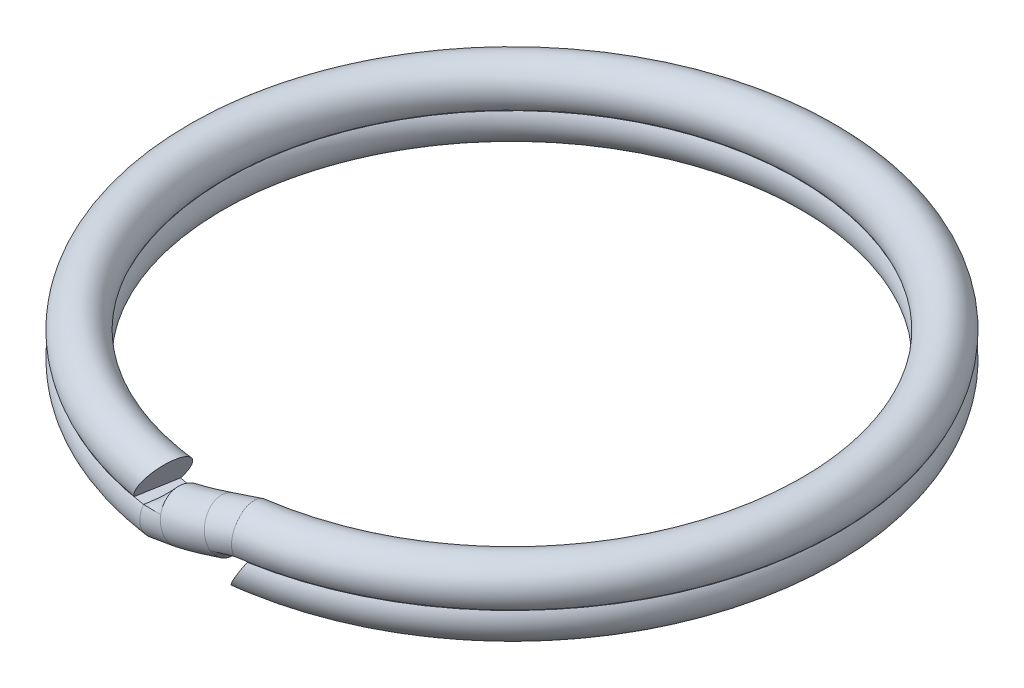
ISO-10303-21;
HEADER;
FILE_DESCRIPTION(('STEP AP214'),'2;1');
FILE_NAME('part.step','',(''),(''),'','','');
FILE_SCHEMA(('AUTOMOTIVE_DESIGN { 1 0 10303 214 1 1 1 1 }'));
ENDSEC;
DATA;
#1=APPLICATION_CONTEXT('core data for automotive mechanical design processes');
#2=APPLICATION_PROTOCOL_DEFINITION('international standard','automotive_design',2000,#1);
#3=PRODUCT_CONTEXT('',#1,'mechanical');
#4=PRODUCT('Part','Part','',(#3));
#5=PRODUCT_RELATED_PRODUCT_CATEGORY('part','',(#4));
#6=PRODUCT_DEFINITION_FORMATION('','',#4);
#7=PRODUCT_DEFINITION_CONTEXT('part definition',#1,'design');
#8=PRODUCT_DEFINITION('design','',#6,#7);
#9=PRODUCT_DEFINITION_SHAPE('','',#8);
#10=(LENGTH_UNIT() NAMED_UNIT(*) SI_UNIT(.MILLI.,.METRE.));
#11=(NAMED_UNIT(*) PLANE_ANGLE_UNIT() SI_UNIT($,.RADIAN.));
#12=(NAMED_UNIT(*) SI_UNIT($,.STERADIAN.) SOLID_ANGLE_UNIT());
#13=UNCERTAINTY_MEASURE_WITH_UNIT(LENGTH_MEASURE(1.E-05),#10,'distance_accuracy_value','');
#14=(GEOMETRIC_REPRESENTATION_CONTEXT(3) GLOBAL_UNCERTAINTY_ASSIGNED_CONTEXT((#13)) GLOBAL_UNIT_ASSIGNED_CONTEXT((#10,
#11,#12)) REPRESENTATION_CONTEXT('',''));
#15=CARTESIAN_POINT('',(0.,0.,0.));
#16=DIRECTION('',(0.,0.,1.));
#17=DIRECTION('',(1.,0.,0.));
#18=AXIS2_PLACEMENT_3D('',#15,#16,#17);
#19=CARTESIAN_POINT('',(-0.000247264741250497,-0.0100000000000067,-14.1672261061629));
#20=DIRECTION('',(0.,1.,0.));
#21=DIRECTION('',(0.,0.,-1.));
#22=AXIS2_PLACEMENT_3D('',#19,#20,#21);
#23=PLANE('',#22);
#24=CARTESIAN_POINT('',(0.,-0.01000000000001,0.));
#25=DIRECTION('',(0.,1.,0.));
#26=DIRECTION('',(0.,0.,-1.));
#27=AXIS2_PLACEMENT_3D('',#24,#25,#26);
#28=CIRCLE('',#27,14.1672261083207);
#29=CARTESIAN_POINT('',(2.45442700180832,-0.01000000000001,13.9529955098208));
#30=VERTEX_POINT('',#29);
#31=CARTESIAN_POINT('',(-1.9716967894974,-0.01000000000001,14.0293516377119));
#32=VERTEX_POINT('',#31);
#33=EDGE_CURVE('E13',#30,#32,#28,.T.);
#34=ORIENTED_EDGE('',*,*,#33,.F.);
#35=DIRECTION('',(0.17364817766693,0.,0.984807753012208));
#36=VECTOR('',#35,1.);
#37=CARTESIAN_POINT('',(-2.42843159783578,-0.0100000000000067,-13.7390716941048));
#38=LINE('',#37,#36);
#39=CARTESIAN_POINT('',(2.79921378117034,-0.01000000000001,15.9083785032612));
#40=VERTEX_POINT('',#39);
#41=EDGE_CURVE('E97',#30,#40,#38,.T.);
#42=ORIENTED_EDGE('',*,*,#41,.T.);
#43=CARTESIAN_POINT('',(0.,-0.01000000000001,0.));
#44=DIRECTION('',(0.,1.,0.));
#45=DIRECTION('',(0.,0.,-1.));
#46=AXIS2_PLACEMENT_3D('',#43,#44,#45);
#47=CIRCLE('',#46,16.1527738916793);
#48=CARTESIAN_POINT('',(-2.24803163161179,-0.01000000000001,15.9955762065325));
#49=VERTEX_POINT('',#48);
#50=EDGE_CURVE('E305',#40,#49,#47,.T.);
#51=ORIENTED_EDGE('',*,*,#50,.T.);
#52=DIRECTION('',(0.139173100960066,0.,-0.99026806874157));
#53=VECTOR('',#52,1.);
#54=CARTESIAN_POINT('',(-2.24803163161179,-0.0100000000000067,15.9955762065325));
#55=LINE('',#54,#53);
#56=EDGE_CURVE('E323',#49,#32,#55,.T.);
#57=ORIENTED_EDGE('',*,*,#56,.T.);
#58=EDGE_LOOP('',(#34,#42,#51,#57));
#59=FACE_BOUND('',#58,.T.);
#60=ADVANCED_FACE('F79',(#59),#23,.T.);
#61=CARTESIAN_POINT('',(0.,-0.610000000000004,0.));
#62=DIRECTION('',(0.,1.,0.));
#63=DIRECTION('',(0.,0.,-1.));
#64=AXIS2_PLACEMENT_3D('',#61,#62,#63);
#65=TOROIDAL_SURFACE('',#64,15.16,1.16);
#66=ORIENTED_EDGE('',*,*,#50,.F.);
#67=CARTESIAN_POINT('',(2.79930650983857,-0.00980000000002514,15.9082394281338));
#68=CARTESIAN_POINT('',(2.77026880045595,-0.0724381777679327,15.9518195426377));
#69=CARTESIAN_POINT('',(2.73848436077802,-0.137914686635183,15.9892591373831));
#70=CARTESIAN_POINT('',(2.67062390868274,-0.272381484915059,16.0514823232684));
#71=CARTESIAN_POINT('',(2.6345565854513,-0.34136450288687,16.0762910169426));
#72=CARTESIAN_POINT('',(2.55925690858548,-0.480855720794433,16.1130295921322));
#73=CARTESIAN_POINT('',(2.52002878288431,-0.551361793970344,16.1249763803383));
#74=CARTESIAN_POINT('',(2.43939982941386,-0.69218707966547,16.1359266715269));
#75=CARTESIAN_POINT('',(2.39799776896257,-0.762506161888424,16.1349227504097));
#76=CARTESIAN_POINT('',(2.31233947816636,-0.90400205424407,16.1195799038511));
#77=CARTESIAN_POINT('',(2.26803636050906,-0.975091215185689,16.1046836487901));
#78=CARTESIAN_POINT('',(2.17951784514438,-1.11288301225348,16.0608041840619));
#79=CARTESIAN_POINT('',(2.13530244973517,-1.1795855348916,16.0318206101));
#80=CARTESIAN_POINT('',(2.04965594179575,-1.30439641111536,15.9610697838222));
#81=CARTESIAN_POINT('',(2.00818124083626,-1.36269854699817,15.9196996219868));
#82=CARTESIAN_POINT('',(1.92817750932939,-1.47052454663615,15.8244787831424));
#83=CARTESIAN_POINT('',(1.88964672335345,-1.52005366525853,15.7706356221313));
#84=CARTESIAN_POINT('',(1.8209181383616,-1.60329612822704,15.6576232933277));
#85=CARTESIAN_POINT('',(1.7902720760024,-1.63809839079433,15.5995323632382));
#86=CARTESIAN_POINT('',(1.73420948673364,-1.69647707904384,15.4756846990764));
#87=CARTESIAN_POINT('',(1.70878678803208,-1.72006679699349,15.4099371575308));
#88=CARTESIAN_POINT('',(1.66752732294195,-1.75202603094436,15.2822020492258));
#89=CARTESIAN_POINT('',(1.650864203801,-1.7620061313701,15.2208829188145));
#90=CARTESIAN_POINT('',(1.62330521050077,-1.77150826925623,15.0961810722891));
#91=CARTESIAN_POINT('',(1.61240485204731,-1.77103845062376,15.0328000015668));
#92=CARTESIAN_POINT('',(1.5976340297815,-1.76006287275399,14.9125386005896));
#93=CARTESIAN_POINT('',(1.59317400902962,-1.75055617426433,14.8556364316183));
#94=CARTESIAN_POINT('',(1.58941876057395,-1.72328912695904,14.7436811254554));
#95=CARTESIAN_POINT('',(1.5901227814073,-1.70552997937854,14.6886277204058));
#96=CARTESIAN_POINT('',(1.59647835379539,-1.66279604249256,14.5825889859404));
#97=CARTESIAN_POINT('',(1.60206331157416,-1.63792139561911,14.5315589407843));
#98=CARTESIAN_POINT('',(1.61771775255161,-1.58183777093924,14.4338712990809));
#99=CARTESIAN_POINT('',(1.62778828687195,-1.55062730937158,14.3872147304901));
#100=CARTESIAN_POINT('',(1.65284441769747,-1.48036505034788,14.2957052054421));
#101=CARTESIAN_POINT('',(1.66814565876901,-1.44089733854376,14.251259514735));
#102=CARTESIAN_POINT('',(1.70271015977786,-1.3571739882564,14.1689188276892));
#103=CARTESIAN_POINT('',(1.7219753276518,-1.31291604899773,14.131027002115));
#104=CARTESIAN_POINT('',(1.76669420582848,-1.21447999943221,14.0573574597559));
#105=CARTESIAN_POINT('',(1.79263425568505,-1.15977373965337,14.0225819056526));
#106=CARTESIAN_POINT('',(1.84793906998279,-1.04722557244376,13.962027830872));
#107=CARTESIAN_POINT('',(1.87730532314987,-0.989382307833049,13.9362532407895));
#108=CARTESIAN_POINT('',(1.94334369986019,-0.86297932594136,13.8905073519031));
#109=CARTESIAN_POINT('',(1.98045013383227,-0.794117252775527,13.8719938687206));
#110=CARTESIAN_POINT('',(2.05724009476718,-0.655577860068326,13.846871769259));
#111=CARTESIAN_POINT('',(2.09692687935009,-0.585899604758329,13.8402785165921));
#112=CARTESIAN_POINT('',(2.18202648091491,-0.440364908888126,13.8390245533157));
#113=CARTESIAN_POINT('',(2.22761248411407,-0.364596286246601,13.8456380099991));
#114=CARTESIAN_POINT('',(2.31941932184459,-0.216415626554013,13.8736252994693));
#115=CARTESIAN_POINT('',(2.36563800727003,-0.143994738420782,13.8949575157477));
#116=CARTESIAN_POINT('',(2.42586796922235,-0.0526325750479024,13.9327751534876));
#117=CARTESIAN_POINT('',(2.44024738711478,-0.031049704362042,13.9425655587008));
#118=CARTESIAN_POINT('',(2.45456171993387,-0.00980000000000684,13.9530945687393));
#119=B_SPLINE_CURVE_WITH_KNOTS('',3,(#67,#68,#69,#70,#71,#72,#73,#74,#75,#76,#77,#78,#79,#80,
#81,#82,#83,#84,#85,#86,#87,#88,#89,#90,#91,#92,#93,#94,#95,#96,#97,#98,#99,#100,#101,#102,#103,
#104,#105,#106,#107,#108,#109,#110,#111,#112,#113,#114,#115,#116,#117,#118),.UNSPECIFIED.,.F.,
.F.,(4,2,2,2,2,2,2,2,2,2,2,2,2,2,2,2,2,2,2,2,2,2,2,2,2,4),(0.,0.244442104600478,
0.488396492131621,0.732029814002172,0.97580280686281,1.2297964269369,1.48379661557367,
1.73039588819417,1.97684694942843,2.19854273552713,2.41997504574169,2.6118682429643,
2.80361189782452,2.97635593279866,3.14907483084285,3.31947336784659,3.48991185599071,
3.67331713117677,3.85681089126628,4.06546293835242,4.27420598725931,4.51437439786218,
4.75485213393863,5.01964935253698,5.28370092282716,5.36681802321146),.UNSPECIFIED.);
#120=EDGE_CURVE('E90',#40,#30,#119,.T.);
#121=ORIENTED_EDGE('',*,*,#120,.T.);
#122=ORIENTED_EDGE('',*,*,#33,.T.);
#123=CARTESIAN_POINT('',(-2.24803163161179,-0.0100000000000108,15.9955762065325));
#124=CARTESIAN_POINT('',(-2.25604256474566,-0.105241647612739,16.0525769576012));
#125=CARTESIAN_POINT('',(-2.263722062622,-0.225424987315131,16.1072194242736));
#126=CARTESIAN_POINT('',(-2.27240300123487,-0.53193518078214,16.1689875120415));
#127=CARTESIAN_POINT('',(-2.27328461423672,-0.721036379465518,16.1752605145018));
#128=CARTESIAN_POINT('',(-2.26113721989127,-1.02897629245318,16.0888273125703));
#129=CARTESIAN_POINT('',(-2.25480151054975,-1.13484825752173,16.0437463981518));
#130=CARTESIAN_POINT('',(-2.23676801232705,-1.33702216962556,15.9154313909094));
#131=CARTESIAN_POINT('',(-2.22504354806371,-1.43306264813932,15.8320074928788));
#132=CARTESIAN_POINT('',(-2.19696510905035,-1.59522440156845,15.6322190180714));
#133=CARTESIAN_POINT('',(-2.18062897269775,-1.66096510332263,15.5159813680873));
#134=CARTESIAN_POINT('',(-2.14591517042232,-1.74840460093638,15.2689798304279));
#135=CARTESIAN_POINT('',(-2.12759503489837,-1.77000000000001,15.1386252928108));
#136=CARTESIAN_POINT('',(-2.09213338621083,-1.77,14.8863025514336));
#137=CARTESIAN_POINT('',(-2.07381325068687,-1.74840460093638,14.7559480138165));
#138=CARTESIAN_POINT('',(-2.03909944841144,-1.66096510332263,14.5089464761571));
#139=CARTESIAN_POINT('',(-2.02276331205884,-1.59522440156845,14.392708826173));
#140=CARTESIAN_POINT('',(-1.99468487304548,-1.43306264813932,14.1929203513656));
#141=CARTESIAN_POINT('',(-1.98296040878214,-1.33702216962556,14.109496453335));
#142=CARTESIAN_POINT('',(-1.96492691055944,-1.13484825752173,13.9811814460926));
#143=CARTESIAN_POINT('',(-1.95859120121793,-1.02897629245318,13.9361005316741));
#144=CARTESIAN_POINT('',(-1.94644380687248,-0.721036379465516,13.8496673297427));
#145=CARTESIAN_POINT('',(-1.94732541987433,-0.531935180782137,13.8559403322029));
#146=CARTESIAN_POINT('',(-1.9560063584872,-0.225424987315129,13.9177084199708));
#147=CARTESIAN_POINT('',(-1.96368585636354,-0.105241647612737,13.9723508866432));
#148=CARTESIAN_POINT('',(-1.9716967894974,-0.0100000000000087,14.0293516377119));
#149=B_SPLINE_CURVE_WITH_KNOTS('',3,(#123,#124,#125,#126,#127,#128,#129,#130,#131,#132,#133,
#134,#135,#136,#137,#138,#139,#140,#141,#142,#143,#144,#145,#146,#147,#148),.UNSPECIFIED.,.F.,
.F.,(4,2,2,2,2,2,2,2,2,2,2,2,4),(0.,0.125,0.25,0.3125,0.375,0.4375,0.5,0.5625,0.625,0.6875,0.75,
0.875,1.),.UNSPECIFIED.);
#150=EDGE_CURVE('E308',#32,#49,#149,.F.);
#151=ORIENTED_EDGE('',*,*,#150,.T.);
#152=EDGE_LOOP('',(#66,#121,#122,#151));
#153=FACE_BOUND('',#152,.T.);
#154=ADVANCED_FACE('F81',(#153),#65,.T.);
#155=CARTESIAN_POINT('',(0.,0.,0.));
#156=DIRECTION('',(-0.852868531952443,0.500000000000001,0.150383733180435));
#157=DIRECTION('',(-0.505751557519977,-0.862679176789447,0.));
#158=AXIS2_PLACEMENT_3D('',#155,#156,#157);
#159=PLANE('',#158);
#160=ORIENTED_EDGE('',*,*,#120,.F.);
#161=ORIENTED_EDGE('',*,*,#41,.F.);
#162=EDGE_LOOP('',(#160,#161));
#163=FACE_BOUND('',#162,.T.);
#164=ADVANCED_FACE('F289',(#163),#159,.T.);
#165=CARTESIAN_POINT('',(-2.24803163161179,-0.0100000000000108,15.9955762065325));
#166=CARTESIAN_POINT('',(-1.22324830780551,0.159764482728053,16.1704310559297));
#167=CARTESIAN_POINT('',(-2.25604256474566,-0.105241647612739,16.0525769576012));
#168=CARTESIAN_POINT('',(-1.1980510529914,0.0605401106211243,16.218380984122));
#169=CARTESIAN_POINT('',(-2.263722062622,-0.225424987315131,16.1072194242736));
#170=CARTESIAN_POINT('',(-1.16587960361662,-0.0612013712749404,16.2599552402179));
#171=CARTESIAN_POINT('',(-2.27240300123487,-0.53193518078214,16.1689875120415));
#172=CARTESIAN_POINT('',(-1.0831876712905,-0.354682314656631,16.2896118992778));
#173=CARTESIAN_POINT('',(-2.27328461423672,-0.721036379465518,16.1752605145018));
#174=CARTESIAN_POINT('',(-1.03208484167273,-0.528124357848302,16.276456515204));
#175=CARTESIAN_POINT('',(-2.26113721989127,-1.02897629245318,16.0888273125703));
#176=CARTESIAN_POINT('',(-0.947110608409819,-0.795580701727408,16.1713915635649));
#177=CARTESIAN_POINT('',(-2.25480151054975,-1.13484825752173,16.0437463981518));
#178=CARTESIAN_POINT('',(-0.917578554198549,-0.88531582778619,16.1220995437286));
#179=CARTESIAN_POINT('',(-2.23676801232705,-1.33702216962556,15.9154313909094));
#180=CARTESIAN_POINT('',(-0.859508548151624,-1.05354124314122,15.9925090312137));
#181=CARTESIAN_POINT('',(-2.22504354806371,-1.43306264813932,15.8320074928788));
#182=CARTESIAN_POINT('',(-0.831015626631528,-1.13185388577129,15.9121235692646));
#183=CARTESIAN_POINT('',(-2.19696510905035,-1.59522440156845,15.6322190180714));
#184=CARTESIAN_POINT('',(-0.779452602835592,-1.26328923982537,15.7257993009933));
#185=CARTESIAN_POINT('',(-2.18062897269775,-1.66096510332263,15.5159813680873));
#186=CARTESIAN_POINT('',(-0.756450132628366,-1.3162031619365,15.6199603328279));
#187=CARTESIAN_POINT('',(-2.14591517042232,-1.74840460093638,15.2689798304279));
#188=CARTESIAN_POINT('',(-0.719492443720995,-1.38779807076383,15.3966035628726));
#189=CARTESIAN_POINT('',(-2.12759503489837,-1.77000000000001,15.1386252928108));
#190=CARTESIAN_POINT('',(-0.705570217466573,-1.40642646439241,15.2793301167882));
#191=CARTESIAN_POINT('',(-2.09213338621083,-1.77,14.8863025514336));
#192=CARTESIAN_POINT('',(-0.687860288841409,-1.40990280717912,15.0498386054885));
#193=CARTESIAN_POINT('',(-2.07381325068687,-1.74840460093638,14.7559480138165));
#194=CARTESIAN_POINT('',(-0.683585630645351,-1.39484634257063,14.9313103946678));
#195=CARTESIAN_POINT('',(-2.03909944841144,-1.66096510332263,14.5089464761571));
#196=CARTESIAN_POINT('',(-0.68567836127334,-1.33009519628965,14.7028747189118));
#197=CARTESIAN_POINT('',(-2.02276331205884,-1.59522440156845,14.392708826173));
#198=CARTESIAN_POINT('',(-0.692050752586743,-1.28044564954832,14.5932152500619));
#199=CARTESIAN_POINT('',(-1.99468487304548,-1.43306264813932,14.1929203513656));
#200=CARTESIAN_POINT('',(-0.714117372333569,-1.15480024607057,14.3973146948227));
#201=CARTESIAN_POINT('',(-1.98296040878214,-1.33702216962556,14.109496453335));
#202=CARTESIAN_POINT('',(-0.72976056878489,-1.07900992015896,14.3111888800619));
#203=CARTESIAN_POINT('',(-1.96492691055944,-1.13484825752173,13.9811814460926));
#204=CARTESIAN_POINT('',(-0.766874160202362,-0.914898111491697,14.1692187687863));
#205=CARTESIAN_POINT('',(-1.95859120121793,-1.02897629245318,13.9361005316741));
#206=CARTESIAN_POINT('',(-0.788287130284545,-0.826756708374674,14.113300828346));
#207=CARTESIAN_POINT('',(-1.94644380687248,-0.721036379465516,13.8496673297427));
#208=CARTESIAN_POINT('',(-0.855517926787301,-0.562783284709313,13.9884400584352));
#209=CARTESIAN_POINT('',(-1.94732541987433,-0.531935180782137,13.8559403322029));
#210=CARTESIAN_POINT('',(-0.90359490015158,-0.389935197246266,13.9623853282683));
#211=CARTESIAN_POINT('',(-1.9560063584872,-0.225424987315129,13.9177084199708));
#212=CARTESIAN_POINT('',(-0.989175147237402,-0.0958872966287149,13.9701564721849));
#213=CARTESIAN_POINT('',(-1.96368585636354,-0.105241647612737,13.9723508866432));
#214=CARTESIAN_POINT('',(-1.02706005159951,0.0269756989929425,14.0026191841388));
#215=CARTESIAN_POINT('',(-1.9716967894974,-0.0100000000000087,14.0293516377119));
#216=CARTESIAN_POINT('',(-1.05908361397534,0.127540030483916,14.0431269607794));
#217=B_SPLINE_SURFACE_WITH_KNOTS('',3,1,((#165,#166),(#167,#168),(#169,#170),(#171,#172),(#173,
#174),(#175,#176),(#177,#178),(#179,#180),(#181,#182),(#183,#184),(#185,#186),(#187,#188),(#189,
#190),(#191,#192),(#193,#194),(#195,#196),(#197,#198),(#199,#200),(#201,#202),(#203,#204),(#205,
#206),(#207,#208),(#209,#210),(#211,#212),(#213,#214),(#215,#216)),.UNSPECIFIED.,.F.,.F.,.F.,(4,
2,2,2,2,2,2,2,2,2,2,2,4),(2,2),(0.,0.125,0.25,0.3125,0.375,0.4375,0.5,0.5625,0.625,0.6875,0.75,
0.875,1.),(0.,1.),.UNSPECIFIED.);
#218=DIRECTION('',(0.98872297765662,0.149010547003397,0.0149241527590682));
#219=VECTOR('',#218,1.);
#220=CARTESIAN_POINT('',(-1.51539020173637,0.0587700152419538,14.0362392992456));
#221=LINE('',#220,#219);
#222=CARTESIAN_POINT('',(-1.0591479289858,0.128184545251658,14.0414505674586));
#223=VERTEX_POINT('',#222);
#224=EDGE_CURVE('E356',#32,#223,#221,.T.);
#225=CARTESIAN_POINT('',(-1.01590095115834,-0.293715385618915,15.1230710019389));
#226=DIRECTION('',(0.958315333271212,0.277066339327014,0.0697564737441255));
#227=DIRECTION('',(-0.277742907089374,0.960655441644684,0.));
#228=AXIS2_PLACEMENT_3D('',#225,#226,#227);
#229=CIRCLE('',#228,1.16);
#230=CARTESIAN_POINT('',(-1.22356537695935,0.160463814475099,16.1720092742482));
#231=VERTEX_POINT('',#230);
#232=EDGE_CURVE('E259',#231,#223,#229,.T.);
#233=DIRECTION('',(-0.972867524965818,-0.161164168368117,-0.165996655692504));
#234=VECTOR('',#233,1.);
#235=CARTESIAN_POINT('',(-1.73563996970865,0.0748822413640213,16.0830036312311));
#236=LINE('',#235,#234);
#237=EDGE_CURVE('E247',#231,#49,#236,.T.);
#238=ORIENTED_EDGE('',*,*,#150,.F.);
#239=ORIENTED_EDGE('',*,*,#224,.T.);
#240=ORIENTED_EDGE('',*,*,#232,.F.);
#241=ORIENTED_EDGE('',*,*,#237,.T.);
#242=EDGE_LOOP('',(#238,#239,#240,#241));
#243=FACE_BOUND('',#242,.T.);
#244=ADVANCED_FACE('F231',(#243),#217,.T.);
#245=CARTESIAN_POINT('',(-1.9716967894974,-0.0100000000000067,14.0293516377119));
#246=CARTESIAN_POINT('',(-1.05908361397534,0.127540030483916,14.0431269607794));
#247=CARTESIAN_POINT('',(-1.99472469300693,-0.0100000000000067,14.1932036851136));
#248=CARTESIAN_POINT('',(-1.1094567111701,0.285727829363606,14.1068457359085));
#249=CARTESIAN_POINT('',(-2.01775259651647,-0.0100000000000067,14.3570557325153));
#250=CARTESIAN_POINT('',(-1.16718025642824,0.456523629139783,14.2214672336144));
#251=CARTESIAN_POINT('',(-2.05229445178077,-0.0100000000000067,14.6028338036179));
#252=CARTESIAN_POINT('',(-1.24513757446985,0.658368247314995,14.4907374925757));
#253=CARTESIAN_POINT('',(-2.06380840353553,-0.0100000000000067,14.6847598273188));
#254=CARTESIAN_POINT('',(-1.26939533036255,0.7157581243738,14.5960435075925));
#255=CARTESIAN_POINT('',(-2.08683630704506,-0.0100000000000067,14.8486118747205));
#256=CARTESIAN_POINT('',(-1.30950254419537,0.796109792529234,14.8278874436186));
#257=CARTESIAN_POINT('',(-2.09835025879983,-0.0100000000000067,14.9305378984213));
#258=CARTESIAN_POINT('',(-1.32526197091833,0.818805344672483,14.9542459914025));
#259=CARTESIAN_POINT('',(-2.12137816230936,-0.0100000000000067,15.0943899458231));
#260=CARTESIAN_POINT('',(-1.34491132740704,0.822662384423391,15.2088692940766));
#261=CARTESIAN_POINT('',(-2.13289211406413,-0.0100000000000067,15.1763159695239));
#262=CARTESIAN_POINT('',(-1.34877356414267,0.803818436070941,15.3367751928994));
#263=CARTESIAN_POINT('',(-2.15592001757366,-0.0100000000000067,15.3401680169256));
#264=CARTESIAN_POINT('',(-1.34489080016823,0.730577389738608,15.5743404747166));
#265=CARTESIAN_POINT('',(-2.16743396932843,-0.0100000000000067,15.4220940406265));
#266=CARTESIAN_POINT('',(-1.33720663191799,0.676440799187626,15.6838008631241));
#267=CARTESIAN_POINT('',(-2.20197582459273,-0.0100000000000067,15.6678721117291));
#268=CARTESIAN_POINT('',(-1.30194500114972,0.482977064279516,15.9677964024457));
#269=CARTESIAN_POINT('',(-2.22500372810226,-0.0100000000000067,15.8317241591308));
#270=CARTESIAN_POINT('',(-1.26288361604811,0.315844524091658,16.0950057686064));
#271=CARTESIAN_POINT('',(-2.24803163161179,-0.0100000000000067,15.9955762065325));
#272=CARTESIAN_POINT('',(-1.22324830780551,0.159764482728053,16.1704310559297));
#273=B_SPLINE_SURFACE_WITH_KNOTS('',3,1,((#245,#246),(#247,#248),(#249,#250),(#251,#252),(#253,
#254),(#255,#256),(#257,#258),(#259,#260),(#261,#262),(#263,#264),(#265,#266),(#267,#268),(#269,
#270),(#271,#272)),.UNSPECIFIED.,.F.,.F.,.F.,(4,2,2,2,2,2,4),(2,2),(0.,0.250000000000001,
0.375000000000001,0.5,0.625000000000002,0.750000000000002,1.),(0.,1.),.UNSPECIFIED.);
#274=EDGE_CURVE('E84',#223,#231,#229,.T.);
#275=ORIENTED_EDGE('',*,*,#56,.F.);
#276=ORIENTED_EDGE('',*,*,#237,.F.);
#277=ORIENTED_EDGE('',*,*,#274,.F.);
#278=ORIENTED_EDGE('',*,*,#224,.F.);
#279=EDGE_LOOP('',(#275,#276,#277,#278));
#280=FACE_BOUND('',#279,.T.);
#281=ADVANCED_FACE('F294',(#280),#273,.T.);
#282=CARTESIAN_POINT('',(0.000247264741250497,0.0100000000000067,-14.1672261061629));
#283=DIRECTION('',(0.,-1.,0.));
#284=DIRECTION('',(0.,0.,-1.));
#285=AXIS2_PLACEMENT_3D('',#282,#283,#284);
#286=PLANE('',#285);
#287=CARTESIAN_POINT('',(0.,0.01000000000001,0.));
#288=DIRECTION('',(0.,-1.,0.));
#289=DIRECTION('',(0.,0.,-1.));
#290=AXIS2_PLACEMENT_3D('',#287,#288,#289);
#291=CIRCLE('',#290,14.1672261083207);
#292=CARTESIAN_POINT('',(-2.45442700180832,0.01000000000001,13.9529955098208));
#293=VERTEX_POINT('',#292);
#294=CARTESIAN_POINT('',(1.9716967894974,0.01000000000001,14.0293516377119));
#295=VERTEX_POINT('',#294);
#296=EDGE_CURVE('E222',#293,#295,#291,.T.);
#297=ORIENTED_EDGE('',*,*,#296,.F.);
#298=DIRECTION('',(-0.17364817766693,0.,0.984807753012208));
#299=VECTOR('',#298,1.);
#300=CARTESIAN_POINT('',(2.42843159783578,0.0100000000000067,-13.7390716941048));
#301=LINE('',#300,#299);
#302=CARTESIAN_POINT('',(-2.79921378117034,0.01000000000001,15.9083785032612));
#303=VERTEX_POINT('',#302);
#304=EDGE_CURVE('E204',#293,#303,#301,.T.);
#305=ORIENTED_EDGE('',*,*,#304,.T.);
#306=CARTESIAN_POINT('',(0.,0.01000000000001,0.));
#307=DIRECTION('',(0.,-1.,0.));
#308=DIRECTION('',(0.,0.,-1.));
#309=AXIS2_PLACEMENT_3D('',#306,#307,#308);
#310=CIRCLE('',#309,16.1527738916793);
#311=CARTESIAN_POINT('',(2.24803163161179,0.01000000000001,15.9955762065325));
#312=VERTEX_POINT('',#311);
#313=EDGE_CURVE('E212',#303,#312,#310,.T.);
#314=ORIENTED_EDGE('',*,*,#313,.T.);
#315=DIRECTION('',(-0.139173100960066,0.,-0.99026806874157));
#316=VECTOR('',#315,1.);
#317=CARTESIAN_POINT('',(2.24803163161179,0.0100000000000067,15.9955762065325));
#318=LINE('',#317,#316);
#319=EDGE_CURVE('E149',#312,#295,#318,.T.);
#320=ORIENTED_EDGE('',*,*,#319,.T.);
#321=EDGE_LOOP('',(#297,#305,#314,#320));
#322=FACE_BOUND('',#321,.T.);
#323=ADVANCED_FACE('F229',(#322),#286,.T.);
#324=CARTESIAN_POINT('',(0.,0.610000000000004,0.));
#325=DIRECTION('',(0.,-1.,0.));
#326=DIRECTION('',(0.,0.,-1.));
#327=AXIS2_PLACEMENT_3D('',#324,#325,#326);
#328=TOROIDAL_SURFACE('',#327,15.16,1.16);
#329=ORIENTED_EDGE('',*,*,#313,.F.);
#330=CARTESIAN_POINT('',(-2.79930650983857,0.00980000000002514,15.9082394281338));
#331=CARTESIAN_POINT('',(-2.77026880045595,0.0724381777679327,15.9518195426377));
#332=CARTESIAN_POINT('',(-2.73848436077802,0.137914686635183,15.9892591373831));
#333=CARTESIAN_POINT('',(-2.67062390868274,0.272381484915059,16.0514823232684));
#334=CARTESIAN_POINT('',(-2.6345565854513,0.34136450288687,16.0762910169426));
#335=CARTESIAN_POINT('',(-2.55925690858548,0.480855720794433,16.1130295921322));
#336=CARTESIAN_POINT('',(-2.52002878288431,0.551361793970344,16.1249763803383));
#337=CARTESIAN_POINT('',(-2.43939982941386,0.69218707966547,16.1359266715269));
#338=CARTESIAN_POINT('',(-2.39799776896257,0.762506161888424,16.1349227504097));
#339=CARTESIAN_POINT('',(-2.31233947816636,0.90400205424407,16.1195799038511));
#340=CARTESIAN_POINT('',(-2.26803636050906,0.975091215185689,16.1046836487901));
#341=CARTESIAN_POINT('',(-2.17951784514438,1.11288301225348,16.0608041840619));
#342=CARTESIAN_POINT('',(-2.13530244973517,1.1795855348916,16.0318206101));
#343=CARTESIAN_POINT('',(-2.04965594179575,1.30439641111536,15.9610697838222));
#344=CARTESIAN_POINT('',(-2.00818124083626,1.36269854699817,15.9196996219868));
#345=CARTESIAN_POINT('',(-1.92817750932939,1.47052454663615,15.8244787831424));
#346=CARTESIAN_POINT('',(-1.88964672335345,1.52005366525853,15.7706356221313));
#347=CARTESIAN_POINT('',(-1.8209181383616,1.60329612822704,15.6576232933277));
#348=CARTESIAN_POINT('',(-1.7902720760024,1.63809839079433,15.5995323632382));
#349=CARTESIAN_POINT('',(-1.73420948673364,1.69647707904384,15.4756846990764));
#350=CARTESIAN_POINT('',(-1.70878678803208,1.72006679699349,15.4099371575308));
#351=CARTESIAN_POINT('',(-1.66752732294195,1.75202603094436,15.2822020492258));
#352=CARTESIAN_POINT('',(-1.650864203801,1.7620061313701,15.2208829188145));
#353=CARTESIAN_POINT('',(-1.62330521050077,1.77150826925623,15.0961810722891));
#354=CARTESIAN_POINT('',(-1.61240485204731,1.77103845062376,15.0328000015668));
#355=CARTESIAN_POINT('',(-1.5976340297815,1.76006287275399,14.9125386005896));
#356=CARTESIAN_POINT('',(-1.59317400902962,1.75055617426433,14.8556364316183));
#357=CARTESIAN_POINT('',(-1.58941876057395,1.72328912695904,14.7436811254554));
#358=CARTESIAN_POINT('',(-1.5901227814073,1.70552997937854,14.6886277204058));
#359=CARTESIAN_POINT('',(-1.59647835379539,1.66279604249256,14.5825889859404));
#360=CARTESIAN_POINT('',(-1.60206331157416,1.63792139561911,14.5315589407843));
#361=CARTESIAN_POINT('',(-1.61771775255161,1.58183777093924,14.4338712990809));
#362=CARTESIAN_POINT('',(-1.62778828687195,1.55062730937158,14.3872147304901));
#363=CARTESIAN_POINT('',(-1.65284441769747,1.48036505034788,14.2957052054421));
#364=CARTESIAN_POINT('',(-1.66814565876901,1.44089733854376,14.251259514735));
#365=CARTESIAN_POINT('',(-1.70271015977786,1.3571739882564,14.1689188276892));
#366=CARTESIAN_POINT('',(-1.7219753276518,1.31291604899773,14.131027002115));
#367=CARTESIAN_POINT('',(-1.76669420582848,1.21447999943221,14.0573574597559));
#368=CARTESIAN_POINT('',(-1.79263425568505,1.15977373965337,14.0225819056526));
#369=CARTESIAN_POINT('',(-1.84793906998279,1.04722557244376,13.962027830872));
#370=CARTESIAN_POINT('',(-1.87730532314987,0.989382307833049,13.9362532407895));
#371=CARTESIAN_POINT('',(-1.94334369986019,0.86297932594136,13.8905073519031));
#372=CARTESIAN_POINT('',(-1.98045013383227,0.794117252775527,13.8719938687206));
#373=CARTESIAN_POINT('',(-2.05724009476718,0.655577860068326,13.846871769259));
#374=CARTESIAN_POINT('',(-2.09692687935009,0.585899604758329,13.8402785165921));
#375=CARTESIAN_POINT('',(-2.18202648091491,0.440364908888126,13.8390245533157));
#376=CARTESIAN_POINT('',(-2.22761248411407,0.364596286246601,13.8456380099991));
#377=CARTESIAN_POINT('',(-2.31941932184459,0.216415626554013,13.8736252994693));
#378=CARTESIAN_POINT('',(-2.36563800727003,0.143994738420782,13.8949575157477));
#379=CARTESIAN_POINT('',(-2.42586796922235,0.0526325750479024,13.9327751534876));
#380=CARTESIAN_POINT('',(-2.44024738711478,0.031049704362042,13.9425655587008));
#381=CARTESIAN_POINT('',(-2.45456171993387,0.00980000000000684,13.9530945687393));
#382=B_SPLINE_CURVE_WITH_KNOTS('',3,(#330,#331,#332,#333,#334,#335,#336,#337,#338,#339,#340,
#341,#342,#343,#344,#345,#346,#347,#348,#349,#350,#351,#352,#353,#354,#355,#356,#357,#358,#359,
#360,#361,#362,#363,#364,#365,#366,#367,#368,#369,#370,#371,#372,#373,#374,#375,#376,#377,#378,
#379,#380,#381),.UNSPECIFIED.,.F.,.F.,(4,2,2,2,2,2,2,2,2,2,2,2,2,2,2,2,2,2,2,2,2,2,2,2,2,4),(0.,
0.244442104600478,0.488396492131621,0.732029814002172,0.97580280686281,1.2297964269369,
1.48379661557367,1.73039588819417,1.97684694942843,2.19854273552713,2.41997504574169,
2.6118682429643,2.80361189782452,2.97635593279866,3.14907483084285,3.31947336784659,
3.48991185599071,3.67331713117677,3.85681089126628,4.06546293835242,4.27420598725931,
4.51437439786218,4.75485213393863,5.01964935253698,5.28370092282716,5.36681802321146),.UNSPECIFIED.);
#383=EDGE_CURVE('E214',#303,#293,#382,.T.);
#384=ORIENTED_EDGE('',*,*,#383,.T.);
#385=ORIENTED_EDGE('',*,*,#296,.T.);
#386=CARTESIAN_POINT('',(2.24803163161179,0.0100000000000113,15.9955762065325));
#387=CARTESIAN_POINT('',(2.25604256474566,0.105241647612739,16.0525769576012));
#388=CARTESIAN_POINT('',(2.263722062622,0.225424987315131,16.1072194242737));
#389=CARTESIAN_POINT('',(2.27240300123487,0.53193518078214,16.1689875120415));
#390=CARTESIAN_POINT('',(2.27328461423672,0.721036379465518,16.1752605145018));
#391=CARTESIAN_POINT('',(2.26113721989127,1.02897629245318,16.0888273125703));
#392=CARTESIAN_POINT('',(2.25480151054975,1.13484825752173,16.0437463981518));
#393=CARTESIAN_POINT('',(2.23676801232705,1.33702216962556,15.9154313909094));
#394=CARTESIAN_POINT('',(2.22504354806371,1.43306264813932,15.8320074928788));
#395=CARTESIAN_POINT('',(2.19696510905035,1.59522440156845,15.6322190180714));
#396=CARTESIAN_POINT('',(2.18062897269775,1.66096510332263,15.5159813680873));
#397=CARTESIAN_POINT('',(2.14591517042232,1.74840460093638,15.2689798304279));
#398=CARTESIAN_POINT('',(2.12759503489837,1.77000000000001,15.1386252928108));
#399=CARTESIAN_POINT('',(2.09213338621083,1.77,14.8863025514336));
#400=CARTESIAN_POINT('',(2.07381325068687,1.74840460093638,14.7559480138165));
#401=CARTESIAN_POINT('',(2.03909944841144,1.66096510332263,14.5089464761571));
#402=CARTESIAN_POINT('',(2.02276331205884,1.59522440156845,14.392708826173));
#403=CARTESIAN_POINT('',(1.99468487304548,1.43306264813932,14.1929203513656));
#404=CARTESIAN_POINT('',(1.98296040878214,1.33702216962556,14.109496453335));
#405=CARTESIAN_POINT('',(1.96492691055944,1.13484825752173,13.9811814460926));
#406=CARTESIAN_POINT('',(1.95859120121793,1.02897629245318,13.9361005316741));
#407=CARTESIAN_POINT('',(1.94644380687248,0.721036379465516,13.8496673297427));
#408=CARTESIAN_POINT('',(1.94732541987433,0.531935180782137,13.8559403322029));
#409=CARTESIAN_POINT('',(1.9560063584872,0.225424987315129,13.9177084199708));
#410=CARTESIAN_POINT('',(1.96368585636354,0.105241647612737,13.9723508866432));
#411=CARTESIAN_POINT('',(1.9716967894974,0.0100000000000087,14.0293516377119));
#412=B_SPLINE_CURVE_WITH_KNOTS('',3,(#386,#387,#388,#389,#390,#391,#392,#393,#394,#395,#396,
#397,#398,#399,#400,#401,#402,#403,#404,#405,#406,#407,#408,#409,#410,#411),.UNSPECIFIED.,.F.,
.F.,(4,2,2,2,2,2,2,2,2,2,2,2,4),(0.,0.125000000000001,0.250000000000001,0.312500000000001,
0.375000000000001,0.437500000000001,0.500000000000001,0.562500000000001,0.625,0.6875,0.75,0.875,
1.),.UNSPECIFIED.);
#413=EDGE_CURVE('E213',#295,#312,#412,.F.);
#414=ORIENTED_EDGE('',*,*,#413,.T.);
#415=EDGE_LOOP('',(#329,#384,#385,#414));
#416=FACE_BOUND('',#415,.T.);
#417=ADVANCED_FACE('F225',(#416),#328,.T.);
#418=CARTESIAN_POINT('',(0.,0.,0.));
#419=DIRECTION('',(0.852868531952443,-0.500000000000001,0.150383733180435));
#420=DIRECTION('',(0.505751557519977,0.862679176789447,0.));
#421=AXIS2_PLACEMENT_3D('',#418,#419,#420);
#422=PLANE('',#421);
#423=ORIENTED_EDGE('',*,*,#383,.F.);
#424=ORIENTED_EDGE('',*,*,#304,.F.);
#425=EDGE_LOOP('',(#423,#424));
#426=FACE_BOUND('',#425,.T.);
#427=ADVANCED_FACE('F181',(#426),#422,.T.);
#428=CARTESIAN_POINT('',(1.22324830780551,-0.159764482728054,16.1704310559297));
#429=CARTESIAN_POINT('',(2.24803163161179,0.0100000000000067,15.9955762065325));
#430=CARTESIAN_POINT('',(1.26288361604811,-0.315844524091659,16.0950057686064));
#431=CARTESIAN_POINT('',(2.22500372810226,0.0100000000000067,15.8317241591308));
#432=CARTESIAN_POINT('',(1.30194500114972,-0.482977064279517,15.9677964024457));
#433=CARTESIAN_POINT('',(2.20197582459272,0.0100000000000067,15.667872111729));
#434=CARTESIAN_POINT('',(1.33720663191799,-0.676440799187627,15.6838008631241));
#435=CARTESIAN_POINT('',(2.16743396932842,0.0100000000000067,15.4220940406264));
#436=CARTESIAN_POINT('',(1.34489080016823,-0.730577389738609,15.5743404747166));
#437=CARTESIAN_POINT('',(2.15592001757365,0.0100000000000067,15.3401680169256));
#438=CARTESIAN_POINT('',(1.34877356414267,-0.803818436070941,15.3367751928994));
#439=CARTESIAN_POINT('',(2.13289211406412,0.0100000000000067,15.1763159695239));
#440=CARTESIAN_POINT('',(1.34491132740704,-0.822662384423391,15.2088692940765));
#441=CARTESIAN_POINT('',(2.12137816230935,0.0100000000000068,15.094389945823));
#442=CARTESIAN_POINT('',(1.32526197091833,-0.818805344672483,14.9542459914025));
#443=CARTESIAN_POINT('',(2.09835025879982,0.0100000000000067,14.9305378984213));
#444=CARTESIAN_POINT('',(1.30950254419537,-0.796109792529235,14.8278874436186));
#445=CARTESIAN_POINT('',(2.08683630704506,0.0100000000000067,14.8486118747204));
#446=CARTESIAN_POINT('',(1.26939533036255,-0.715758124373801,14.5960435075925));
#447=CARTESIAN_POINT('',(2.06380840353552,0.0100000000000067,14.6847598273187));
#448=CARTESIAN_POINT('',(1.24513757446985,-0.658368247314995,14.4907374925757));
#449=CARTESIAN_POINT('',(2.05229445178076,0.0100000000000067,14.6028338036179));
#450=CARTESIAN_POINT('',(1.16718025642824,-0.456523629139784,14.2214672336144));
#451=CARTESIAN_POINT('',(2.01775259651646,0.0100000000000067,14.3570557325153));
#452=CARTESIAN_POINT('',(1.1094567111701,-0.285727829363608,14.1068457359085));
#453=CARTESIAN_POINT('',(1.99472469300693,0.0100000000000067,14.1932036851136));
#454=CARTESIAN_POINT('',(1.05908361397534,-0.127540030483918,14.0431269607794));
#455=CARTESIAN_POINT('',(1.9716967894974,0.0100000000000067,14.0293516377119));
#456=B_SPLINE_SURFACE_WITH_KNOTS('',3,1,((#428,#429),(#430,#431),(#432,#433),(#434,#435),(#436,
#437),(#438,#439),(#440,#441),(#442,#443),(#444,#445),(#446,#447),(#448,#449),(#450,#451),(#452,
#453),(#454,#455)),.UNSPECIFIED.,.F.,.F.,.F.,(4,2,2,2,2,2,4),(2,2),(0.,0.25,0.375,0.5,0.625,
0.75,1.),(0.,1.),.UNSPECIFIED.);
#457=CARTESIAN_POINT('',(1.01590095115834,0.293715385618915,15.1230710019389));
#458=DIRECTION('',(0.958315333271212,0.277066339327014,-0.0697564737441254));
#459=DIRECTION('',(-0.277742907089374,0.960655441644684,0.));
#460=AXIS2_PLACEMENT_3D('',#457,#458,#459);
#461=CIRCLE('',#460,1.16);
#462=CARTESIAN_POINT('',(1.22356707377983,-0.160470511930416,16.1720059835093));
#463=VERTEX_POINT('',#462);
#464=CARTESIAN_POINT('',(1.05914663613206,-0.128180480985486,14.0414489491111));
#465=VERTEX_POINT('',#464);
#466=EDGE_CURVE('E132',#463,#465,#461,.T.);
#467=DIRECTION('',(0.98872297765662,0.149010547003396,-0.0149241527590663));
#468=VECTOR('',#467,1.);
#469=CARTESIAN_POINT('',(1.51539020173637,-0.0587700152419555,14.0362392992456));
#470=LINE('',#469,#468);
#471=EDGE_CURVE('E153',#465,#295,#470,.T.);
#472=DIRECTION('',(-0.972867524965819,-0.161164168368114,0.165996655692508));
#473=VECTOR('',#472,1.);
#474=CARTESIAN_POINT('',(1.73563996970865,-0.0748822413640236,16.0830036312311));
#475=LINE('',#474,#473);
#476=EDGE_CURVE('E146',#312,#463,#475,.T.);
#477=ORIENTED_EDGE('',*,*,#466,.T.);
#478=ORIENTED_EDGE('',*,*,#471,.T.);
#479=ORIENTED_EDGE('',*,*,#319,.F.);
#480=ORIENTED_EDGE('',*,*,#476,.T.);
#481=EDGE_LOOP('',(#477,#478,#479,#480));
#482=FACE_BOUND('',#481,.T.);
#483=ADVANCED_FACE('F147',(#482),#456,.T.);
#484=CARTESIAN_POINT('',(1.05908361397534,-0.127540030483918,14.0431269607794));
#485=CARTESIAN_POINT('',(1.9716967894974,0.0100000000000087,14.0293516377119));
#486=CARTESIAN_POINT('',(1.02706005159951,-0.0269756989929442,14.0026191841388));
#487=CARTESIAN_POINT('',(1.96368585636354,0.105241647612737,13.9723508866432));
#488=CARTESIAN_POINT('',(0.989175147237402,0.0958872966287137,13.9701564721849));
#489=CARTESIAN_POINT('',(1.9560063584872,0.225424987315129,13.9177084199708));
#490=CARTESIAN_POINT('',(0.90359490015158,0.389935197246265,13.9623853282683));
#491=CARTESIAN_POINT('',(1.94732541987433,0.531935180782137,13.8559403322029));
#492=CARTESIAN_POINT('',(0.855517926787301,0.562783284709312,13.9884400584352));
#493=CARTESIAN_POINT('',(1.94644380687248,0.721036379465516,13.8496673297427));
#494=CARTESIAN_POINT('',(0.788287130284545,0.826756708374673,14.113300828346));
#495=CARTESIAN_POINT('',(1.95859120121793,1.02897629245318,13.9361005316741));
#496=CARTESIAN_POINT('',(0.766874160202362,0.914898111491696,14.1692187687863));
#497=CARTESIAN_POINT('',(1.96492691055944,1.13484825752173,13.9811814460926));
#498=CARTESIAN_POINT('',(0.72976056878489,1.07900992015896,14.3111888800619));
#499=CARTESIAN_POINT('',(1.98296040878214,1.33702216962556,14.109496453335));
#500=CARTESIAN_POINT('',(0.714117372333569,1.15480024607057,14.3973146948227));
#501=CARTESIAN_POINT('',(1.99468487304548,1.43306264813932,14.1929203513656));
#502=CARTESIAN_POINT('',(0.692050752586743,1.28044564954832,14.5932152500619));
#503=CARTESIAN_POINT('',(2.02276331205884,1.59522440156845,14.392708826173));
#504=CARTESIAN_POINT('',(0.68567836127334,1.33009519628965,14.7028747189118));
#505=CARTESIAN_POINT('',(2.03909944841144,1.66096510332263,14.5089464761571));
#506=CARTESIAN_POINT('',(0.68358563064535,1.39484634257063,14.9313103946678));
#507=CARTESIAN_POINT('',(2.07381325068687,1.74840460093638,14.7559480138165));
#508=CARTESIAN_POINT('',(0.687860288841408,1.40990280717912,15.0498386054885));
#509=CARTESIAN_POINT('',(2.09213338621083,1.77,14.8863025514336));
#510=CARTESIAN_POINT('',(0.705570217466573,1.40642646439241,15.2793301167882));
#511=CARTESIAN_POINT('',(2.12759503489837,1.77000000000001,15.1386252928108));
#512=CARTESIAN_POINT('',(0.719492443720995,1.38779807076383,15.3966035628726));
#513=CARTESIAN_POINT('',(2.14591517042232,1.74840460093638,15.2689798304279));
#514=CARTESIAN_POINT('',(0.756450132628365,1.3162031619365,15.6199603328279));
#515=CARTESIAN_POINT('',(2.18062897269775,1.66096510332263,15.5159813680873));
#516=CARTESIAN_POINT('',(0.779452602835592,1.26328923982537,15.7257993009933));
#517=CARTESIAN_POINT('',(2.19696510905035,1.59522440156845,15.6322190180714));
#518=CARTESIAN_POINT('',(0.831015626631528,1.13185388577129,15.9121235692646));
#519=CARTESIAN_POINT('',(2.22504354806371,1.43306264813932,15.8320074928788));
#520=CARTESIAN_POINT('',(0.859508548151623,1.05354124314122,15.9925090312137));
#521=CARTESIAN_POINT('',(2.23676801232705,1.33702216962556,15.9154313909094));
#522=CARTESIAN_POINT('',(0.917578554198549,0.885315827786191,16.1220995437286));
#523=CARTESIAN_POINT('',(2.25480151054975,1.13484825752173,16.0437463981518));
#524=CARTESIAN_POINT('',(0.947110608409818,0.795580701727409,16.1713915635649));
#525=CARTESIAN_POINT('',(2.26113721989127,1.02897629245318,16.0888273125703));
#526=CARTESIAN_POINT('',(1.03208484167273,0.528124357848302,16.276456515204));
#527=CARTESIAN_POINT('',(2.27328461423672,0.721036379465518,16.1752605145018));
#528=CARTESIAN_POINT('',(1.0831876712905,0.354682314656631,16.2896118992778));
#529=CARTESIAN_POINT('',(2.27240300123487,0.53193518078214,16.1689875120415));
#530=CARTESIAN_POINT('',(1.16587960361662,0.0612013712749411,16.2599552402179));
#531=CARTESIAN_POINT('',(2.263722062622,0.225424987315131,16.1072194242737));
#532=CARTESIAN_POINT('',(1.1980510529914,-0.0605401106211239,16.218380984122));
#533=CARTESIAN_POINT('',(2.25604256474566,0.105241647612739,16.0525769576012));
#534=CARTESIAN_POINT('',(1.22324830780551,-0.159764482728053,16.1704310559297));
#535=CARTESIAN_POINT('',(2.24803163161179,0.0100000000000113,15.9955762065325));
#536=B_SPLINE_SURFACE_WITH_KNOTS('',3,1,((#484,#485),(#486,#487),(#488,#489),(#490,#491),(#492,
#493),(#494,#495),(#496,#497),(#498,#499),(#500,#501),(#502,#503),(#504,#505),(#506,#507),(#508,
#509),(#510,#511),(#512,#513),(#514,#515),(#516,#517),(#518,#519),(#520,#521),(#522,#523),(#524,
#525),(#526,#527),(#528,#529),(#530,#531),(#532,#533),(#534,#535)),.UNSPECIFIED.,.F.,.F.,.F.,(4,
2,2,2,2,2,2,2,2,2,2,2,4),(2,2),(0.,0.125,0.25,0.3125,0.375,0.437499999999999,0.499999999999999,
0.562499999999999,0.624999999999999,0.687499999999999,0.749999999999999,0.874999999999999,1.),
(0.,1.),.UNSPECIFIED.);
#537=EDGE_CURVE('E138',#465,#463,#461,.T.);
#538=ORIENTED_EDGE('',*,*,#537,.T.);
#539=ORIENTED_EDGE('',*,*,#476,.F.);
#540=ORIENTED_EDGE('',*,*,#413,.F.);
#541=ORIENTED_EDGE('',*,*,#471,.F.);
#542=EDGE_LOOP('',(#538,#539,#540,#541));
#543=FACE_BOUND('',#542,.T.);
#544=ADVANCED_FACE('F156',(#543),#536,.T.);
#545=CARTESIAN_POINT('',(0.,0.,0.));
#546=DIRECTION('',(0.277742907089374,-0.960655441644684,0.));
#547=DIRECTION('',(0.960655441644684,0.277742907089374,0.));
#548=AXIS2_PLACEMENT_3D('',#545,#546,#547);
#549=TOROIDAL_SURFACE('',#548,15.16,1.16);
#550=ORIENTED_EDGE('',*,*,#466,.F.);
#551=ORIENTED_EDGE('',*,*,#537,.F.);
#552=EDGE_LOOP('',(#550,#551));
#553=FACE_BOUND('',#552,.T.);
#554=ORIENTED_EDGE('',*,*,#232,.T.);
#555=ORIENTED_EDGE('',*,*,#274,.T.);
#556=EDGE_LOOP('',(#554,#555));
#557=FACE_BOUND('',#556,.T.);
#558=ADVANCED_FACE('F135',(#553,#557),#549,.T.);
#559=CLOSED_SHELL('',(#60,#154,#164,#244,#281,#323,#417,#427,#483,#544,#558));
#560=MANIFOLD_SOLID_BREP('B2',#559);
#561=ADVANCED_BREP_SHAPE_REPRESENTATION('',(#18,#560),#14);
#562=SHAPE_DEFINITION_REPRESENTATION(#9,#561);
ENDSEC;
END-ISO-10303-21;
